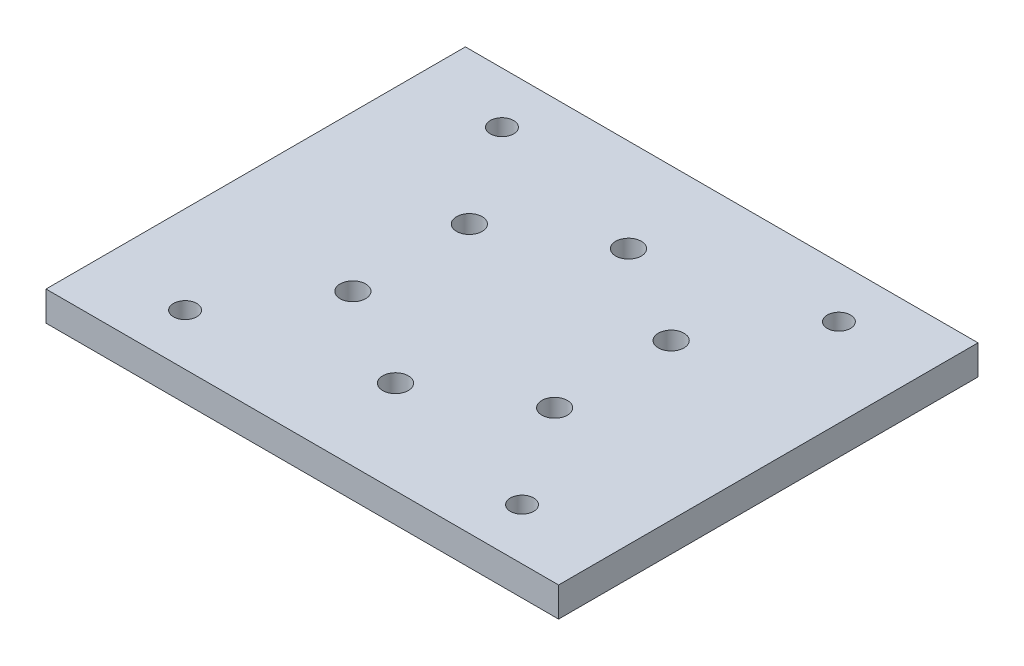
ISO-10303-21;
HEADER;
FILE_DESCRIPTION(('STEP AP214'),'2;1');
FILE_NAME('part.step','',(''),(''),'','','');
FILE_SCHEMA(('AUTOMOTIVE_DESIGN { 1 0 10303 214 1 1 1 1 }'));
ENDSEC;
DATA;
#1=APPLICATION_CONTEXT('core data for automotive mechanical design processes');
#2=APPLICATION_PROTOCOL_DEFINITION('international standard','automotive_design',2000,#1);
#3=PRODUCT_CONTEXT('',#1,'mechanical');
#4=PRODUCT('Part','Part','',(#3));
#5=PRODUCT_RELATED_PRODUCT_CATEGORY('part','',(#4));
#6=PRODUCT_DEFINITION_FORMATION('','',#4);
#7=PRODUCT_DEFINITION_CONTEXT('part definition',#1,'design');
#8=PRODUCT_DEFINITION('design','',#6,#7);
#9=PRODUCT_DEFINITION_SHAPE('','',#8);
#10=(LENGTH_UNIT() NAMED_UNIT(*) SI_UNIT(.MILLI.,.METRE.));
#11=(NAMED_UNIT(*) PLANE_ANGLE_UNIT() SI_UNIT($,.RADIAN.));
#12=(NAMED_UNIT(*) SI_UNIT($,.STERADIAN.) SOLID_ANGLE_UNIT());
#13=UNCERTAINTY_MEASURE_WITH_UNIT(LENGTH_MEASURE(1.E-05),#10,'distance_accuracy_value','');
#14=(GEOMETRIC_REPRESENTATION_CONTEXT(3) GLOBAL_UNCERTAINTY_ASSIGNED_CONTEXT((#13)) GLOBAL_UNIT_ASSIGNED_CONTEXT((#10,
#11,#12)) REPRESENTATION_CONTEXT('',''));
#15=CARTESIAN_POINT('',(0.,0.,0.));
#16=DIRECTION('',(0.,0.,1.));
#17=DIRECTION('',(1.,0.,0.));
#18=AXIS2_PLACEMENT_3D('',#15,#16,#17);
#19=CARTESIAN_POINT('',(110.,6.35,0.));
#20=DIRECTION('',(0.,0.,-1.));
#21=DIRECTION('',(-1.,0.,0.));
#22=AXIS2_PLACEMENT_3D('',#19,#20,#21);
#23=PLANE('',#22);
#24=DIRECTION('',(1.,0.,0.));
#25=VECTOR('',#24,1.);
#26=CARTESIAN_POINT('',(110.,0.,0.));
#27=LINE('',#26,#25);
#28=CARTESIAN_POINT('',(0.,0.,0.));
#29=VERTEX_POINT('',#28);
#30=CARTESIAN_POINT('',(110.,0.,0.));
#31=VERTEX_POINT('',#30);
#32=EDGE_CURVE('E106',#29,#31,#27,.T.);
#33=ORIENTED_EDGE('',*,*,#32,.T.);
#34=DIRECTION('',(0.,-1.,0.));
#35=VECTOR('',#34,1.);
#36=CARTESIAN_POINT('',(110.,6.35,0.));
#37=LINE('',#36,#35);
#38=CARTESIAN_POINT('',(110.,6.35,0.));
#39=VERTEX_POINT('',#38);
#40=EDGE_CURVE('E11',#39,#31,#37,.T.);
#41=ORIENTED_EDGE('',*,*,#40,.F.);
#42=DIRECTION('',(1.,0.,0.));
#43=VECTOR('',#42,1.);
#44=CARTESIAN_POINT('',(110.,6.35,0.));
#45=LINE('',#44,#43);
#46=CARTESIAN_POINT('',(0.,6.35,0.));
#47=VERTEX_POINT('',#46);
#48=EDGE_CURVE('E94',#47,#39,#45,.T.);
#49=ORIENTED_EDGE('',*,*,#48,.F.);
#50=DIRECTION('',(0.,-1.,0.));
#51=VECTOR('',#50,1.);
#52=CARTESIAN_POINT('',(0.,6.35,0.));
#53=LINE('',#52,#51);
#54=EDGE_CURVE('E102',#47,#29,#53,.T.);
#55=ORIENTED_EDGE('',*,*,#54,.T.);
#56=EDGE_LOOP('',(#33,#41,#49,#55));
#57=FACE_BOUND('',#56,.T.);
#58=ADVANCED_FACE('F43',(#57),#23,.F.);
#59=CARTESIAN_POINT('',(110.,6.35,-90.));
#60=DIRECTION('',(-1.,0.,0.));
#61=DIRECTION('',(0.,0.,1.));
#62=AXIS2_PLACEMENT_3D('',#59,#60,#61);
#63=PLANE('',#62);
#64=DIRECTION('',(0.,0.,-1.));
#65=VECTOR('',#64,1.);
#66=CARTESIAN_POINT('',(110.,0.,-90.));
#67=LINE('',#66,#65);
#68=CARTESIAN_POINT('',(110.,0.,-90.));
#69=VERTEX_POINT('',#68);
#70=EDGE_CURVE('E98',#31,#69,#67,.T.);
#71=ORIENTED_EDGE('',*,*,#70,.T.);
#72=DIRECTION('',(0.,-1.,0.));
#73=VECTOR('',#72,1.);
#74=CARTESIAN_POINT('',(110.,6.35,-90.));
#75=LINE('',#74,#73);
#76=CARTESIAN_POINT('',(110.,6.35,-90.));
#77=VERTEX_POINT('',#76);
#78=EDGE_CURVE('E51',#77,#69,#75,.T.);
#79=ORIENTED_EDGE('',*,*,#78,.F.);
#80=DIRECTION('',(0.,0.,-1.));
#81=VECTOR('',#80,1.);
#82=CARTESIAN_POINT('',(110.,6.35,-90.));
#83=LINE('',#82,#81);
#84=EDGE_CURVE('E89',#39,#77,#83,.T.);
#85=ORIENTED_EDGE('',*,*,#84,.F.);
#86=ORIENTED_EDGE('',*,*,#40,.T.);
#87=EDGE_LOOP('',(#71,#79,#85,#86));
#88=FACE_BOUND('',#87,.T.);
#89=ADVANCED_FACE('F97',(#88),#63,.F.);
#90=CARTESIAN_POINT('',(0.,6.35,-90.));
#91=DIRECTION('',(0.,0.,1.));
#92=DIRECTION('',(1.,0.,0.));
#93=AXIS2_PLACEMENT_3D('',#90,#91,#92);
#94=PLANE('',#93);
#95=DIRECTION('',(-1.,0.,0.));
#96=VECTOR('',#95,1.);
#97=CARTESIAN_POINT('',(0.,0.,-90.));
#98=LINE('',#97,#96);
#99=CARTESIAN_POINT('',(0.,0.,-90.));
#100=VERTEX_POINT('',#99);
#101=EDGE_CURVE('E76',#69,#100,#98,.T.);
#102=ORIENTED_EDGE('',*,*,#101,.T.);
#103=DIRECTION('',(0.,-1.,0.));
#104=VECTOR('',#103,1.);
#105=CARTESIAN_POINT('',(0.,6.35,-90.));
#106=LINE('',#105,#104);
#107=CARTESIAN_POINT('',(0.,6.35,-90.));
#108=VERTEX_POINT('',#107);
#109=EDGE_CURVE('E99',#108,#100,#106,.T.);
#110=ORIENTED_EDGE('',*,*,#109,.F.);
#111=DIRECTION('',(-1.,0.,0.));
#112=VECTOR('',#111,1.);
#113=CARTESIAN_POINT('',(0.,6.35,-90.));
#114=LINE('',#113,#112);
#115=EDGE_CURVE('E92',#77,#108,#114,.T.);
#116=ORIENTED_EDGE('',*,*,#115,.F.);
#117=ORIENTED_EDGE('',*,*,#78,.T.);
#118=EDGE_LOOP('',(#102,#110,#116,#117));
#119=FACE_BOUND('',#118,.T.);
#120=ADVANCED_FACE('F100',(#119),#94,.F.);
#121=CARTESIAN_POINT('',(0.,6.35,0.));
#122=DIRECTION('',(1.,0.,0.));
#123=DIRECTION('',(0.,0.,-1.));
#124=AXIS2_PLACEMENT_3D('',#121,#122,#123);
#125=PLANE('',#124);
#126=DIRECTION('',(0.,0.,1.));
#127=VECTOR('',#126,1.);
#128=CARTESIAN_POINT('',(0.,0.,0.));
#129=LINE('',#128,#127);
#130=EDGE_CURVE('E82',#100,#29,#129,.T.);
#131=ORIENTED_EDGE('',*,*,#130,.T.);
#132=ORIENTED_EDGE('',*,*,#54,.F.);
#133=DIRECTION('',(0.,0.,1.));
#134=VECTOR('',#133,1.);
#135=CARTESIAN_POINT('',(0.,6.35,0.));
#136=LINE('',#135,#134);
#137=EDGE_CURVE('E59',#108,#47,#136,.T.);
#138=ORIENTED_EDGE('',*,*,#137,.F.);
#139=ORIENTED_EDGE('',*,*,#109,.T.);
#140=EDGE_LOOP('',(#131,#132,#138,#139));
#141=FACE_BOUND('',#140,.T.);
#142=ADVANCED_FACE('F114',(#141),#125,.F.);
#143=CARTESIAN_POINT('',(0.,6.35,0.));
#144=DIRECTION('',(0.,-1.,0.));
#145=DIRECTION('',(0.,0.,-1.));
#146=AXIS2_PLACEMENT_3D('',#143,#144,#145);
#147=PLANE('',#146);
#148=CARTESIAN_POINT('',(55.,6.35,-70.));
#149=DIRECTION('',(0.,1.,0.));
#150=DIRECTION('',(0.,0.,1.));
#151=AXIS2_PLACEMENT_3D('',#148,#149,#150);
#152=CIRCLE('',#151,2.75);
#153=CARTESIAN_POINT('',(55.,6.35,-67.25));
#154=VERTEX_POINT('',#153);
#155=EDGE_CURVE('E169',#154,#154,#152,.T.);
#156=ORIENTED_EDGE('',*,*,#155,.F.);
#157=EDGE_LOOP('',(#156));
#158=FACE_BOUND('',#157,.T.);
#159=CARTESIAN_POINT('',(33.3493649053895,6.35,-57.4999999999997));
#160=DIRECTION('',(0.,1.,0.));
#161=DIRECTION('',(0.,0.,1.));
#162=AXIS2_PLACEMENT_3D('',#159,#160,#161);
#163=CIRCLE('',#162,2.75);
#164=CARTESIAN_POINT('',(33.3493649053895,6.35,-54.7499999999997));
#165=VERTEX_POINT('',#164);
#166=EDGE_CURVE('E148',#165,#165,#163,.T.);
#167=ORIENTED_EDGE('',*,*,#166,.F.);
#168=EDGE_LOOP('',(#167));
#169=FACE_BOUND('',#168,.T.);
#170=CARTESIAN_POINT('',(33.349364905389,6.35,-32.5));
#171=DIRECTION('',(0.,1.,0.));
#172=DIRECTION('',(0.,0.,1.));
#173=AXIS2_PLACEMENT_3D('',#170,#171,#172);
#174=CIRCLE('',#173,2.75);
#175=CARTESIAN_POINT('',(33.349364905389,6.35,-29.75));
#176=VERTEX_POINT('',#175);
#177=EDGE_CURVE('E147',#176,#176,#174,.T.);
#178=ORIENTED_EDGE('',*,*,#177,.F.);
#179=EDGE_LOOP('',(#178));
#180=FACE_BOUND('',#179,.T.);
#181=CARTESIAN_POINT('',(55.,6.35,-19.9999999999999));
#182=DIRECTION('',(0.,1.,0.));
#183=DIRECTION('',(0.,0.,1.));
#184=AXIS2_PLACEMENT_3D('',#181,#182,#183);
#185=CIRCLE('',#184,2.75);
#186=CARTESIAN_POINT('',(55.,6.35,-17.2499999999999));
#187=VERTEX_POINT('',#186);
#188=EDGE_CURVE('E154',#187,#187,#185,.T.);
#189=ORIENTED_EDGE('',*,*,#188,.F.);
#190=EDGE_LOOP('',(#189));
#191=FACE_BOUND('',#190,.T.);
#192=CARTESIAN_POINT('',(76.650635094611,6.35,-32.4999999999999));
#193=DIRECTION('',(0.,1.,0.));
#194=DIRECTION('',(0.,0.,1.));
#195=AXIS2_PLACEMENT_3D('',#192,#193,#194);
#196=CIRCLE('',#195,2.75000000000001);
#197=CARTESIAN_POINT('',(76.650635094611,6.35,-29.7499999999999));
#198=VERTEX_POINT('',#197);
#199=EDGE_CURVE('E160',#198,#198,#196,.T.);
#200=ORIENTED_EDGE('',*,*,#199,.F.);
#201=EDGE_LOOP('',(#200));
#202=FACE_BOUND('',#201,.T.);
#203=CARTESIAN_POINT('',(76.6506350946114,6.35,-57.5000000000006));
#204=DIRECTION('',(0.,1.,0.));
#205=DIRECTION('',(0.,0.,1.));
#206=AXIS2_PLACEMENT_3D('',#203,#204,#205);
#207=CIRCLE('',#206,2.75000000000001);
#208=CARTESIAN_POINT('',(76.6506350946114,6.35,-54.7500000000006));
#209=VERTEX_POINT('',#208);
#210=EDGE_CURVE('E166',#209,#209,#207,.T.);
#211=ORIENTED_EDGE('',*,*,#210,.F.);
#212=EDGE_LOOP('',(#211));
#213=FACE_BOUND('',#212,.T.);
#214=CARTESIAN_POINT('',(91.1499999999999,6.35,-79.));
#215=DIRECTION('',(0.,1.,0.));
#216=DIRECTION('',(0.,0.,-1.));
#217=AXIS2_PLACEMENT_3D('',#214,#215,#216);
#218=CIRCLE('',#217,2.5);
#219=CARTESIAN_POINT('',(91.1499999999999,6.35,-81.5));
#220=VERTEX_POINT('',#219);
#221=EDGE_CURVE('E129',#220,#220,#218,.T.);
#222=ORIENTED_EDGE('',*,*,#221,.F.);
#223=EDGE_LOOP('',(#222));
#224=FACE_BOUND('',#223,.T.);
#225=CARTESIAN_POINT('',(91.15,6.35,-11.));
#226=DIRECTION('',(0.,1.,0.));
#227=DIRECTION('',(0.,0.,1.));
#228=AXIS2_PLACEMENT_3D('',#225,#226,#227);
#229=CIRCLE('',#228,2.50000000000001);
#230=CARTESIAN_POINT('',(91.15,6.35,-8.50000000000001));
#231=VERTEX_POINT('',#230);
#232=EDGE_CURVE('E136',#231,#231,#229,.T.);
#233=ORIENTED_EDGE('',*,*,#232,.F.);
#234=EDGE_LOOP('',(#233));
#235=FACE_BOUND('',#234,.T.);
#236=CARTESIAN_POINT('',(18.85,6.35,-11.));
#237=DIRECTION('',(0.,1.,0.));
#238=DIRECTION('',(0.,0.,-1.));
#239=AXIS2_PLACEMENT_3D('',#236,#237,#238);
#240=CIRCLE('',#239,2.5);
#241=CARTESIAN_POINT('',(18.85,6.35,-13.5));
#242=VERTEX_POINT('',#241);
#243=EDGE_CURVE('E123',#242,#242,#240,.T.);
#244=ORIENTED_EDGE('',*,*,#243,.F.);
#245=EDGE_LOOP('',(#244));
#246=FACE_BOUND('',#245,.T.);
#247=CARTESIAN_POINT('',(18.85,6.35,-79.));
#248=DIRECTION('',(0.,1.,0.));
#249=DIRECTION('',(0.,0.,1.));
#250=AXIS2_PLACEMENT_3D('',#247,#248,#249);
#251=CIRCLE('',#250,2.5);
#252=CARTESIAN_POINT('',(18.85,6.35,-76.5));
#253=VERTEX_POINT('',#252);
#254=EDGE_CURVE('E120',#253,#253,#251,.T.);
#255=ORIENTED_EDGE('',*,*,#254,.F.);
#256=EDGE_LOOP('',(#255));
#257=FACE_BOUND('',#256,.T.);
#258=ORIENTED_EDGE('',*,*,#48,.T.);
#259=ORIENTED_EDGE('',*,*,#84,.T.);
#260=ORIENTED_EDGE('',*,*,#115,.T.);
#261=ORIENTED_EDGE('',*,*,#137,.T.);
#262=EDGE_LOOP('',(#258,#259,#260,#261));
#263=FACE_BOUND('',#262,.T.);
#264=ADVANCED_FACE('F90',(#158,#169,#180,#191,#202,#213,#224,#235,#246,#257,#263),#147,.F.);
#265=CARTESIAN_POINT('',(0.,0.,0.));
#266=DIRECTION('',(0.,-1.,0.));
#267=DIRECTION('',(0.,0.,-1.));
#268=AXIS2_PLACEMENT_3D('',#265,#266,#267);
#269=PLANE('',#268);
#270=CARTESIAN_POINT('',(55.,0.,-70.));
#271=DIRECTION('',(0.,1.,0.));
#272=DIRECTION('',(0.,0.,1.));
#273=AXIS2_PLACEMENT_3D('',#270,#271,#272);
#274=CIRCLE('',#273,2.75);
#275=CARTESIAN_POINT('',(55.,0.,-67.25));
#276=VERTEX_POINT('',#275);
#277=EDGE_CURVE('E130',#276,#276,#274,.T.);
#278=ORIENTED_EDGE('',*,*,#277,.T.);
#279=EDGE_LOOP('',(#278));
#280=FACE_BOUND('',#279,.T.);
#281=CARTESIAN_POINT('',(33.3493649053895,0.,-57.4999999999997));
#282=DIRECTION('',(0.,1.,0.));
#283=DIRECTION('',(0.,0.,1.));
#284=AXIS2_PLACEMENT_3D('',#281,#282,#283);
#285=CIRCLE('',#284,2.75);
#286=CARTESIAN_POINT('',(33.3493649053895,0.,-54.7499999999997));
#287=VERTEX_POINT('',#286);
#288=EDGE_CURVE('E170',#287,#287,#285,.T.);
#289=ORIENTED_EDGE('',*,*,#288,.T.);
#290=EDGE_LOOP('',(#289));
#291=FACE_BOUND('',#290,.T.);
#292=CARTESIAN_POINT('',(33.349364905389,0.,-32.5));
#293=DIRECTION('',(0.,1.,0.));
#294=DIRECTION('',(0.,0.,1.));
#295=AXIS2_PLACEMENT_3D('',#292,#293,#294);
#296=CIRCLE('',#295,2.75);
#297=CARTESIAN_POINT('',(33.349364905389,0.,-29.75));
#298=VERTEX_POINT('',#297);
#299=EDGE_CURVE('E144',#298,#298,#296,.T.);
#300=ORIENTED_EDGE('',*,*,#299,.T.);
#301=EDGE_LOOP('',(#300));
#302=FACE_BOUND('',#301,.T.);
#303=CARTESIAN_POINT('',(55.,0.,-19.9999999999999));
#304=DIRECTION('',(0.,1.,0.));
#305=DIRECTION('',(0.,0.,1.));
#306=AXIS2_PLACEMENT_3D('',#303,#304,#305);
#307=CIRCLE('',#306,2.75);
#308=CARTESIAN_POINT('',(55.,0.,-17.2499999999999));
#309=VERTEX_POINT('',#308);
#310=EDGE_CURVE('E151',#309,#309,#307,.T.);
#311=ORIENTED_EDGE('',*,*,#310,.T.);
#312=EDGE_LOOP('',(#311));
#313=FACE_BOUND('',#312,.T.);
#314=CARTESIAN_POINT('',(76.650635094611,0.,-32.4999999999999));
#315=DIRECTION('',(0.,1.,0.));
#316=DIRECTION('',(0.,0.,1.));
#317=AXIS2_PLACEMENT_3D('',#314,#315,#316);
#318=CIRCLE('',#317,2.75000000000001);
#319=CARTESIAN_POINT('',(76.650635094611,0.,-29.7499999999999));
#320=VERTEX_POINT('',#319);
#321=EDGE_CURVE('E157',#320,#320,#318,.T.);
#322=ORIENTED_EDGE('',*,*,#321,.T.);
#323=EDGE_LOOP('',(#322));
#324=FACE_BOUND('',#323,.T.);
#325=CARTESIAN_POINT('',(76.6506350946114,0.,-57.5000000000006));
#326=DIRECTION('',(0.,1.,0.));
#327=DIRECTION('',(0.,0.,1.));
#328=AXIS2_PLACEMENT_3D('',#325,#326,#327);
#329=CIRCLE('',#328,2.75000000000001);
#330=CARTESIAN_POINT('',(76.6506350946114,0.,-54.7500000000006));
#331=VERTEX_POINT('',#330);
#332=EDGE_CURVE('E163',#331,#331,#329,.T.);
#333=ORIENTED_EDGE('',*,*,#332,.T.);
#334=EDGE_LOOP('',(#333));
#335=FACE_BOUND('',#334,.T.);
#336=CARTESIAN_POINT('',(91.1499999999999,0.,-79.));
#337=DIRECTION('',(0.,1.,0.));
#338=DIRECTION('',(0.,0.,-1.));
#339=AXIS2_PLACEMENT_3D('',#336,#337,#338);
#340=CIRCLE('',#339,2.5);
#341=CARTESIAN_POINT('',(91.1499999999999,0.,-81.5));
#342=VERTEX_POINT('',#341);
#343=EDGE_CURVE('E126',#342,#342,#340,.T.);
#344=ORIENTED_EDGE('',*,*,#343,.T.);
#345=EDGE_LOOP('',(#344));
#346=FACE_BOUND('',#345,.T.);
#347=CARTESIAN_POINT('',(91.15,0.,-11.));
#348=DIRECTION('',(0.,1.,0.));
#349=DIRECTION('',(0.,0.,1.));
#350=AXIS2_PLACEMENT_3D('',#347,#348,#349);
#351=CIRCLE('',#350,2.50000000000001);
#352=CARTESIAN_POINT('',(91.15,0.,-8.50000000000001));
#353=VERTEX_POINT('',#352);
#354=EDGE_CURVE('E133',#353,#353,#351,.T.);
#355=ORIENTED_EDGE('',*,*,#354,.T.);
#356=EDGE_LOOP('',(#355));
#357=FACE_BOUND('',#356,.T.);
#358=CARTESIAN_POINT('',(18.85,0.,-11.));
#359=DIRECTION('',(0.,1.,0.));
#360=DIRECTION('',(0.,0.,-1.));
#361=AXIS2_PLACEMENT_3D('',#358,#359,#360);
#362=CIRCLE('',#361,2.5);
#363=CARTESIAN_POINT('',(18.85,0.,-13.5));
#364=VERTEX_POINT('',#363);
#365=EDGE_CURVE('E139',#364,#364,#362,.T.);
#366=ORIENTED_EDGE('',*,*,#365,.T.);
#367=EDGE_LOOP('',(#366));
#368=FACE_BOUND('',#367,.T.);
#369=CARTESIAN_POINT('',(18.85,0.,-79.));
#370=DIRECTION('',(0.,1.,0.));
#371=DIRECTION('',(0.,0.,1.));
#372=AXIS2_PLACEMENT_3D('',#369,#370,#371);
#373=CIRCLE('',#372,2.5);
#374=CARTESIAN_POINT('',(18.85,0.,-76.5));
#375=VERTEX_POINT('',#374);
#376=EDGE_CURVE('E109',#375,#375,#373,.T.);
#377=ORIENTED_EDGE('',*,*,#376,.T.);
#378=EDGE_LOOP('',(#377));
#379=FACE_BOUND('',#378,.T.);
#380=ORIENTED_EDGE('',*,*,#32,.F.);
#381=ORIENTED_EDGE('',*,*,#130,.F.);
#382=ORIENTED_EDGE('',*,*,#101,.F.);
#383=ORIENTED_EDGE('',*,*,#70,.F.);
#384=EDGE_LOOP('',(#380,#381,#382,#383));
#385=FACE_BOUND('',#384,.T.);
#386=ADVANCED_FACE('F117',(#280,#291,#302,#313,#324,#335,#346,#357,#368,#379,#385),#269,.T.);
#387=CARTESIAN_POINT('',(18.85,0.,-79.));
#388=DIRECTION('',(0.,1.,0.));
#389=DIRECTION('',(0.,0.,1.));
#390=AXIS2_PLACEMENT_3D('',#387,#388,#389);
#391=CYLINDRICAL_SURFACE('',#390,2.5);
#392=ORIENTED_EDGE('',*,*,#376,.F.);
#393=EDGE_LOOP('',(#392));
#394=FACE_BOUND('',#393,.T.);
#395=ORIENTED_EDGE('',*,*,#254,.T.);
#396=EDGE_LOOP('',(#395));
#397=FACE_BOUND('',#396,.T.);
#398=ADVANCED_FACE('F210',(#394,#397),#391,.F.);
#399=CARTESIAN_POINT('',(18.85,0.,-11.));
#400=DIRECTION('',(0.,1.,0.));
#401=DIRECTION('',(0.,0.,1.));
#402=AXIS2_PLACEMENT_3D('',#399,#400,#401);
#403=CYLINDRICAL_SURFACE('',#402,2.5);
#404=ORIENTED_EDGE('',*,*,#365,.F.);
#405=EDGE_LOOP('',(#404));
#406=FACE_BOUND('',#405,.T.);
#407=ORIENTED_EDGE('',*,*,#243,.T.);
#408=EDGE_LOOP('',(#407));
#409=FACE_BOUND('',#408,.T.);
#410=ADVANCED_FACE('F212',(#406,#409),#403,.F.);
#411=CARTESIAN_POINT('',(91.15,0.,-11.));
#412=DIRECTION('',(0.,1.,0.));
#413=DIRECTION('',(0.,0.,1.));
#414=AXIS2_PLACEMENT_3D('',#411,#412,#413);
#415=CYLINDRICAL_SURFACE('',#414,2.50000000000001);
#416=ORIENTED_EDGE('',*,*,#354,.F.);
#417=EDGE_LOOP('',(#416));
#418=FACE_BOUND('',#417,.T.);
#419=ORIENTED_EDGE('',*,*,#232,.T.);
#420=EDGE_LOOP('',(#419));
#421=FACE_BOUND('',#420,.T.);
#422=ADVANCED_FACE('F219',(#418,#421),#415,.F.);
#423=CARTESIAN_POINT('',(91.1499999999999,0.,-79.));
#424=DIRECTION('',(0.,1.,0.));
#425=DIRECTION('',(0.,0.,1.));
#426=AXIS2_PLACEMENT_3D('',#423,#424,#425);
#427=CYLINDRICAL_SURFACE('',#426,2.5);
#428=ORIENTED_EDGE('',*,*,#343,.F.);
#429=EDGE_LOOP('',(#428));
#430=FACE_BOUND('',#429,.T.);
#431=ORIENTED_EDGE('',*,*,#221,.T.);
#432=EDGE_LOOP('',(#431));
#433=FACE_BOUND('',#432,.T.);
#434=ADVANCED_FACE('F279',(#430,#433),#427,.F.);
#435=CARTESIAN_POINT('',(76.6506350946114,0.,-57.5000000000006));
#436=DIRECTION('',(0.,1.,0.));
#437=DIRECTION('',(0.,0.,1.));
#438=AXIS2_PLACEMENT_3D('',#435,#436,#437);
#439=CYLINDRICAL_SURFACE('',#438,2.75000000000001);
#440=ORIENTED_EDGE('',*,*,#332,.F.);
#441=EDGE_LOOP('',(#440));
#442=FACE_BOUND('',#441,.T.);
#443=ORIENTED_EDGE('',*,*,#210,.T.);
#444=EDGE_LOOP('',(#443));
#445=FACE_BOUND('',#444,.T.);
#446=ADVANCED_FACE('F288',(#442,#445),#439,.F.);
#447=CARTESIAN_POINT('',(76.650635094611,0.,-32.4999999999999));
#448=DIRECTION('',(0.,1.,0.));
#449=DIRECTION('',(0.,0.,1.));
#450=AXIS2_PLACEMENT_3D('',#447,#448,#449);
#451=CYLINDRICAL_SURFACE('',#450,2.75000000000001);
#452=ORIENTED_EDGE('',*,*,#321,.F.);
#453=EDGE_LOOP('',(#452));
#454=FACE_BOUND('',#453,.T.);
#455=ORIENTED_EDGE('',*,*,#199,.T.);
#456=EDGE_LOOP('',(#455));
#457=FACE_BOUND('',#456,.T.);
#458=ADVANCED_FACE('F296',(#454,#457),#451,.F.);
#459=CARTESIAN_POINT('',(55.,0.,-19.9999999999999));
#460=DIRECTION('',(0.,1.,0.));
#461=DIRECTION('',(0.,0.,1.));
#462=AXIS2_PLACEMENT_3D('',#459,#460,#461);
#463=CYLINDRICAL_SURFACE('',#462,2.75);
#464=ORIENTED_EDGE('',*,*,#310,.F.);
#465=EDGE_LOOP('',(#464));
#466=FACE_BOUND('',#465,.T.);
#467=ORIENTED_EDGE('',*,*,#188,.T.);
#468=EDGE_LOOP('',(#467));
#469=FACE_BOUND('',#468,.T.);
#470=ADVANCED_FACE('F305',(#466,#469),#463,.F.);
#471=CARTESIAN_POINT('',(33.349364905389,0.,-32.5));
#472=DIRECTION('',(0.,1.,0.));
#473=DIRECTION('',(0.,0.,1.));
#474=AXIS2_PLACEMENT_3D('',#471,#472,#473);
#475=CYLINDRICAL_SURFACE('',#474,2.75);
#476=ORIENTED_EDGE('',*,*,#299,.F.);
#477=EDGE_LOOP('',(#476));
#478=FACE_BOUND('',#477,.T.);
#479=ORIENTED_EDGE('',*,*,#177,.T.);
#480=EDGE_LOOP('',(#479));
#481=FACE_BOUND('',#480,.T.);
#482=ADVANCED_FACE('F314',(#478,#481),#475,.F.);
#483=CARTESIAN_POINT('',(33.3493649053895,0.,-57.4999999999997));
#484=DIRECTION('',(0.,1.,0.));
#485=DIRECTION('',(0.,0.,1.));
#486=AXIS2_PLACEMENT_3D('',#483,#484,#485);
#487=CYLINDRICAL_SURFACE('',#486,2.75);
#488=ORIENTED_EDGE('',*,*,#288,.F.);
#489=EDGE_LOOP('',(#488));
#490=FACE_BOUND('',#489,.T.);
#491=ORIENTED_EDGE('',*,*,#166,.T.);
#492=EDGE_LOOP('',(#491));
#493=FACE_BOUND('',#492,.T.);
#494=ADVANCED_FACE('F185',(#490,#493),#487,.F.);
#495=CARTESIAN_POINT('',(55.,0.,-70.));
#496=DIRECTION('',(0.,1.,0.));
#497=DIRECTION('',(0.,0.,1.));
#498=AXIS2_PLACEMENT_3D('',#495,#496,#497);
#499=CYLINDRICAL_SURFACE('',#498,2.75);
#500=ORIENTED_EDGE('',*,*,#277,.F.);
#501=EDGE_LOOP('',(#500));
#502=FACE_BOUND('',#501,.T.);
#503=ORIENTED_EDGE('',*,*,#155,.T.);
#504=EDGE_LOOP('',(#503));
#505=FACE_BOUND('',#504,.T.);
#506=ADVANCED_FACE('F182',(#502,#505),#499,.F.);
#507=CLOSED_SHELL('',(#58,#89,#120,#142,#264,#386,#398,#410,#422,#434,#446,#458,#470,#482,#494,#506));
#508=MANIFOLD_SOLID_BREP('B2',#507);
#509=ADVANCED_BREP_SHAPE_REPRESENTATION('',(#18,#508),#14);
#510=SHAPE_DEFINITION_REPRESENTATION(#9,#509);
ENDSEC;
END-ISO-10303-21;
